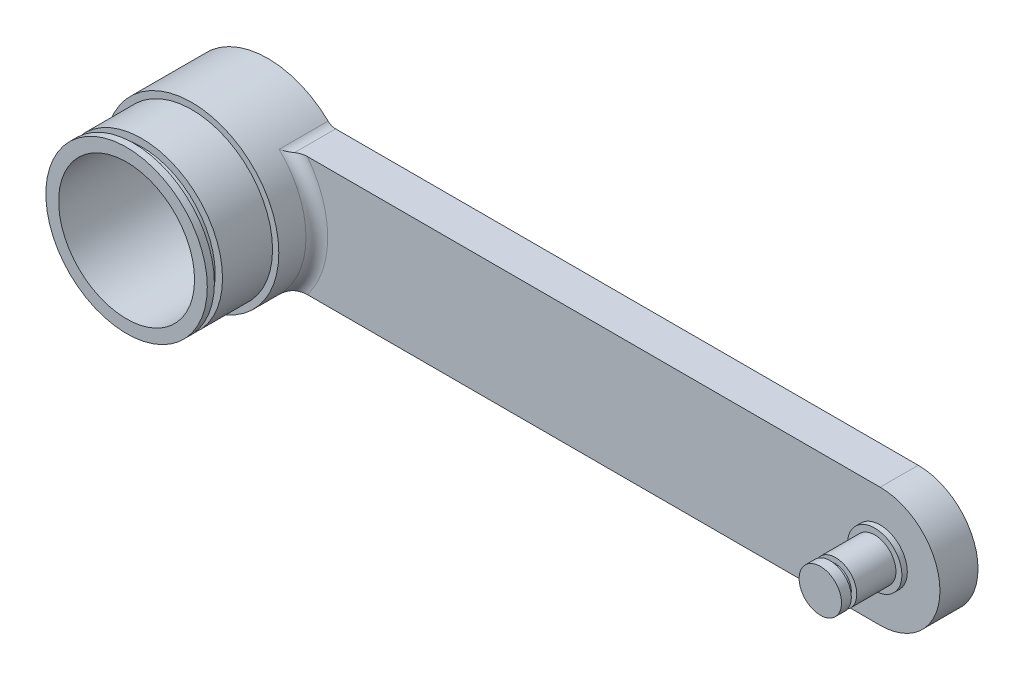
ISO-10303-21;
HEADER;
FILE_DESCRIPTION(('STEP AP214'),'2;1');
FILE_NAME('part.step','',(''),(''),'','','');
FILE_SCHEMA(('AUTOMOTIVE_DESIGN { 1 0 10303 214 1 1 1 1 }'));
ENDSEC;
DATA;
#1=APPLICATION_CONTEXT('core data for automotive mechanical design processes');
#2=APPLICATION_PROTOCOL_DEFINITION('international standard','automotive_design',2000,#1);
#3=PRODUCT_CONTEXT('',#1,'mechanical');
#4=PRODUCT('Part','Part','',(#3));
#5=PRODUCT_RELATED_PRODUCT_CATEGORY('part','',(#4));
#6=PRODUCT_DEFINITION_FORMATION('','',#4);
#7=PRODUCT_DEFINITION_CONTEXT('part definition',#1,'design');
#8=PRODUCT_DEFINITION('design','',#6,#7);
#9=PRODUCT_DEFINITION_SHAPE('','',#8);
#10=(LENGTH_UNIT() NAMED_UNIT(*) SI_UNIT(.MILLI.,.METRE.));
#11=(NAMED_UNIT(*) PLANE_ANGLE_UNIT() SI_UNIT($,.RADIAN.));
#12=(NAMED_UNIT(*) SI_UNIT($,.STERADIAN.) SOLID_ANGLE_UNIT());
#13=UNCERTAINTY_MEASURE_WITH_UNIT(LENGTH_MEASURE(1.E-05),#10,'distance_accuracy_value','');
#14=(GEOMETRIC_REPRESENTATION_CONTEXT(3) GLOBAL_UNCERTAINTY_ASSIGNED_CONTEXT((#13)) GLOBAL_UNIT_ASSIGNED_CONTEXT((#10,
#11,#12)) REPRESENTATION_CONTEXT('',''));
#15=CARTESIAN_POINT('',(0.,0.,0.));
#16=DIRECTION('',(0.,0.,1.));
#17=DIRECTION('',(1.,0.,0.));
#18=AXIS2_PLACEMENT_3D('',#15,#16,#17);
#19=CARTESIAN_POINT('',(119.609580579279,0.,18.));
#20=DIRECTION('',(0.,0.,-1.));
#21=DIRECTION('',(-1.,0.,0.));
#22=AXIS2_PLACEMENT_3D('',#19,#20,#21);
#23=CYLINDRICAL_SURFACE('',#22,3.9);
#24=CARTESIAN_POINT('',(119.609580579279,0.,8.));
#25=DIRECTION('',(0.,0.,1.));
#26=DIRECTION('',(1.,0.,0.));
#27=AXIS2_PLACEMENT_3D('',#24,#25,#26);
#28=CIRCLE('',#27,3.9);
#29=CARTESIAN_POINT('',(123.509580579279,0.,8.));
#30=VERTEX_POINT('',#29);
#31=EDGE_CURVE('E125',#30,#30,#28,.T.);
#32=ORIENTED_EDGE('',*,*,#31,.T.);
#33=EDGE_LOOP('',(#32));
#34=FACE_BOUND('',#33,.T.);
#35=CARTESIAN_POINT('',(119.609580579279,0.,15.2));
#36=DIRECTION('',(0.,0.,1.));
#37=DIRECTION('',(1.,0.,0.));
#38=AXIS2_PLACEMENT_3D('',#35,#36,#37);
#39=CIRCLE('',#38,3.9);
#40=CARTESIAN_POINT('',(123.509580579279,0.,15.2));
#41=VERTEX_POINT('',#40);
#42=EDGE_CURVE('E265',#41,#41,#39,.T.);
#43=ORIENTED_EDGE('',*,*,#42,.F.);
#44=EDGE_LOOP('',(#43));
#45=FACE_BOUND('',#44,.T.);
#46=ADVANCED_FACE('F36',(#34,#45),#23,.T.);
#47=CARTESIAN_POINT('',(0.,0.,26.));
#48=DIRECTION('',(0.,0.,-1.));
#49=DIRECTION('',(-1.,0.,0.));
#50=AXIS2_PLACEMENT_3D('',#47,#48,#49);
#51=CYLINDRICAL_SURFACE('',#50,14.85);
#52=CARTESIAN_POINT('',(0.,0.,14.));
#53=DIRECTION('',(0.,0.,1.));
#54=DIRECTION('',(1.,0.,0.));
#55=AXIS2_PLACEMENT_3D('',#52,#53,#54);
#56=CIRCLE('',#55,14.85);
#57=CARTESIAN_POINT('',(14.85,0.,14.));
#58=VERTEX_POINT('',#57);
#59=EDGE_CURVE('E121',#58,#58,#56,.T.);
#60=ORIENTED_EDGE('',*,*,#59,.T.);
#61=EDGE_LOOP('',(#60));
#62=FACE_BOUND('',#61,.T.);
#63=CARTESIAN_POINT('',(0.,0.,23.2));
#64=DIRECTION('',(0.,0.,1.));
#65=DIRECTION('',(1.,0.,0.));
#66=AXIS2_PLACEMENT_3D('',#63,#64,#65);
#67=CIRCLE('',#66,14.85);
#68=CARTESIAN_POINT('',(14.85,0.,23.2));
#69=VERTEX_POINT('',#68);
#70=EDGE_CURVE('E253',#69,#69,#67,.T.);
#71=ORIENTED_EDGE('',*,*,#70,.F.);
#72=EDGE_LOOP('',(#71));
#73=FACE_BOUND('',#72,.T.);
#74=ADVANCED_FACE('F298',(#62,#73),#51,.T.);
#75=CARTESIAN_POINT('',(0.,0.,0.));
#76=DIRECTION('',(0.,0.,1.));
#77=DIRECTION('',(1.,0.,0.));
#78=AXIS2_PLACEMENT_3D('',#75,#76,#77);
#79=CYLINDRICAL_SURFACE('',#78,6.7);
#80=CARTESIAN_POINT('',(0.,0.,0.));
#81=DIRECTION('',(0.,0.,1.));
#82=DIRECTION('',(1.,0.,0.));
#83=AXIS2_PLACEMENT_3D('',#80,#81,#82);
#84=CIRCLE('',#83,6.7);
#85=CARTESIAN_POINT('',(6.7,0.,0.));
#86=VERTEX_POINT('',#85);
#87=EDGE_CURVE('E210',#86,#86,#84,.T.);
#88=ORIENTED_EDGE('',*,*,#87,.F.);
#89=EDGE_LOOP('',(#88));
#90=FACE_BOUND('',#89,.T.);
#91=CARTESIAN_POINT('',(0.,0.,2.));
#92=DIRECTION('',(0.,0.,1.));
#93=DIRECTION('',(1.,0.,0.));
#94=AXIS2_PLACEMENT_3D('',#91,#92,#93);
#95=CIRCLE('',#94,6.7);
#96=CARTESIAN_POINT('',(6.7,0.,2.));
#97=VERTEX_POINT('',#96);
#98=EDGE_CURVE('E222',#97,#97,#95,.T.);
#99=ORIENTED_EDGE('',*,*,#98,.T.);
#100=EDGE_LOOP('',(#99));
#101=FACE_BOUND('',#100,.T.);
#102=ADVANCED_FACE('F305',(#90,#101),#79,.F.);
#103=CARTESIAN_POINT('',(119.609580579279,0.,7.));
#104=DIRECTION('',(0.,0.,-1.));
#105=DIRECTION('',(-1.,0.,0.));
#106=AXIS2_PLACEMENT_3D('',#103,#104,#105);
#107=CYLINDRICAL_SURFACE('',#106,11.);
#108=CARTESIAN_POINT('',(119.609580579279,0.,0.));
#109=DIRECTION('',(0.,0.,1.));
#110=DIRECTION('',(1.,0.,0.));
#111=AXIS2_PLACEMENT_3D('',#108,#109,#110);
#112=CIRCLE('',#111,11.);
#113=CARTESIAN_POINT('',(119.609580579279,-11.,0.));
#114=VERTEX_POINT('',#113);
#115=CARTESIAN_POINT('',(119.609580579279,11.,0.));
#116=VERTEX_POINT('',#115);
#117=EDGE_CURVE('E120',#114,#116,#112,.T.);
#118=ORIENTED_EDGE('',*,*,#117,.T.);
#119=DIRECTION('',(0.,0.,-1.));
#120=VECTOR('',#119,1.);
#121=CARTESIAN_POINT('',(119.609580579279,11.,7.));
#122=LINE('',#121,#120);
#123=CARTESIAN_POINT('',(119.609580579279,11.,7.));
#124=VERTEX_POINT('',#123);
#125=EDGE_CURVE('E102',#124,#116,#122,.T.);
#126=ORIENTED_EDGE('',*,*,#125,.F.);
#127=CARTESIAN_POINT('',(119.609580579279,0.,7.));
#128=DIRECTION('',(0.,0.,1.));
#129=DIRECTION('',(1.,0.,0.));
#130=AXIS2_PLACEMENT_3D('',#127,#128,#129);
#131=CIRCLE('',#130,11.);
#132=CARTESIAN_POINT('',(119.609580579279,-11.,7.));
#133=VERTEX_POINT('',#132);
#134=EDGE_CURVE('E108',#133,#124,#131,.T.);
#135=ORIENTED_EDGE('',*,*,#134,.F.);
#136=DIRECTION('',(0.,0.,-1.));
#137=VECTOR('',#136,1.);
#138=CARTESIAN_POINT('',(119.609580579279,-11.,7.));
#139=LINE('',#138,#137);
#140=EDGE_CURVE('E122',#133,#114,#139,.T.);
#141=ORIENTED_EDGE('',*,*,#140,.T.);
#142=EDGE_LOOP('',(#118,#126,#135,#141));
#143=FACE_BOUND('',#142,.T.);
#144=ADVANCED_FACE('F118',(#143),#107,.T.);
#145=CARTESIAN_POINT('',(119.609580579279,11.,7.));
#146=DIRECTION('',(0.,-1.,0.));
#147=DIRECTION('',(0.,0.,-1.));
#148=AXIS2_PLACEMENT_3D('',#145,#146,#147);
#149=PLANE('',#148);
#150=DIRECTION('',(-1.,0.,0.));
#151=VECTOR('',#150,1.);
#152=CARTESIAN_POINT('',(119.609580579279,11.,0.));
#153=LINE('',#152,#151);
#154=CARTESIAN_POINT('',(12.4498995979887,11.,0.));
#155=VERTEX_POINT('',#154);
#156=EDGE_CURVE('E206',#116,#155,#153,.T.);
#157=ORIENTED_EDGE('',*,*,#156,.T.);
#158=DIRECTION('',(0.,0.,1.));
#159=VECTOR('',#158,1.);
#160=CARTESIAN_POINT('',(12.4498995979887,11.,7.));
#161=LINE('',#160,#159);
#162=CARTESIAN_POINT('',(12.4498995979887,11.,7.55884833202699));
#163=VERTEX_POINT('',#162);
#164=EDGE_CURVE('E54',#155,#163,#161,.T.);
#165=ORIENTED_EDGE('',*,*,#164,.T.);
#166=CARTESIAN_POINT('',(12.4498995979887,11.,7.55884833202699));
#167=CARTESIAN_POINT('',(12.5198934034948,11.,7.50840170780849));
#168=CARTESIAN_POINT('',(12.592340885976,11.,7.46145728385506));
#169=CARTESIAN_POINT('',(12.7412055261497,11.,7.37451366725892));
#170=CARTESIAN_POINT('',(12.8176188017008,11.,7.33450784297435));
#171=CARTESIAN_POINT('',(12.9717234023388,11.,7.26217367181749));
#172=CARTESIAN_POINT('',(13.0493387757929,11.,7.22968264539804));
#173=CARTESIAN_POINT('',(13.2069412349103,11.,7.17110581897077));
#174=CARTESIAN_POINT('',(13.2869287605535,11.,7.1450212156409));
#175=CARTESIAN_POINT('',(13.509194897095,11.,7.08212802331641));
#176=CARTESIAN_POINT('',(13.6533970955731,11.,7.05185126709123));
#177=CARTESIAN_POINT('',(13.8732117159048,11.,7.0210066230061));
#178=CARTESIAN_POINT('',(13.9478944578916,11.,7.01315092338695));
#179=CARTESIAN_POINT('',(14.0976416219745,11.,7.00265076143241));
#180=CARTESIAN_POINT('',(14.1727061250838,11.,7.00000745579312));
#181=CARTESIAN_POINT('',(14.247806848775,11.,7.));
#182=B_SPLINE_CURVE_WITH_KNOTS('',3,(#166,#167,#168,#169,#170,#171,#172,#173,#174,#175,#176,
#177,#178,#179,#180,#181),.UNSPECIFIED.,.F.,.F.,(4,2,2,2,2,2,2,4),(0.,0.25864631807969,
0.517044053324901,0.769174443388442,1.02135189400267,1.46179163625953,1.68692746322968,
1.91211324506599),.UNSPECIFIED.);
#183=CARTESIAN_POINT('',(14.247806848775,11.,7.));
#184=VERTEX_POINT('',#183);
#185=EDGE_CURVE('E46',#163,#184,#182,.T.);
#186=ORIENTED_EDGE('',*,*,#185,.T.);
#187=DIRECTION('',(-1.,0.,0.));
#188=VECTOR('',#187,1.);
#189=CARTESIAN_POINT('',(119.609580579279,11.,7.));
#190=LINE('',#189,#188);
#191=EDGE_CURVE('E98',#124,#184,#190,.T.);
#192=ORIENTED_EDGE('',*,*,#191,.F.);
#193=ORIENTED_EDGE('',*,*,#125,.T.);
#194=EDGE_LOOP('',(#157,#165,#186,#192,#193));
#195=FACE_BOUND('',#194,.T.);
#196=ADVANCED_FACE('F100',(#195),#149,.F.);
#197=CARTESIAN_POINT('',(0.,0.,7.));
#198=DIRECTION('',(0.,0.,-1.));
#199=DIRECTION('',(-1.,0.,0.));
#200=AXIS2_PLACEMENT_3D('',#197,#198,#199);
#201=CYLINDRICAL_SURFACE('',#200,16.);
#202=CARTESIAN_POINT('',(0.,0.,0.));
#203=DIRECTION('',(0.,0.,1.));
#204=DIRECTION('',(1.,0.,0.));
#205=AXIS2_PLACEMENT_3D('',#202,#203,#204);
#206=CIRCLE('',#205,16.);
#207=CARTESIAN_POINT('',(11.0665774204344,11.5555555555556,0.));
#208=VERTEX_POINT('',#207);
#209=CARTESIAN_POINT('',(11.0665774204344,-11.5555555555556,0.));
#210=VERTEX_POINT('',#209);
#211=EDGE_CURVE('E207',#208,#210,#206,.T.);
#212=ORIENTED_EDGE('',*,*,#211,.T.);
#213=DIRECTION('',(0.,0.,-1.));
#214=VECTOR('',#213,1.);
#215=CARTESIAN_POINT('',(11.0665774204344,-11.5555555555556,7.));
#216=LINE('',#215,#214);
#217=CARTESIAN_POINT('',(11.0665774204344,-11.5555555555556,9.));
#218=VERTEX_POINT('',#217);
#219=EDGE_CURVE('E135',#210,#218,#216,.F.);
#220=ORIENTED_EDGE('',*,*,#219,.T.);
#221=CARTESIAN_POINT('',(0.,0.,9.));
#222=DIRECTION('',(0.,0.,1.));
#223=DIRECTION('',(1.,0.,0.));
#224=AXIS2_PLACEMENT_3D('',#221,#222,#223);
#225=CIRCLE('',#224,16.);
#226=CARTESIAN_POINT('',(11.0665774204344,11.5555555555556,9.));
#227=VERTEX_POINT('',#226);
#228=EDGE_CURVE('E131',#218,#227,#225,.T.);
#229=ORIENTED_EDGE('',*,*,#228,.T.);
#230=DIRECTION('',(0.,0.,-1.));
#231=VECTOR('',#230,1.);
#232=CARTESIAN_POINT('',(11.0665774204344,11.5555555555556,7.));
#233=LINE('',#232,#231);
#234=EDGE_CURVE('E133',#227,#208,#233,.T.);
#235=ORIENTED_EDGE('',*,*,#234,.T.);
#236=EDGE_LOOP('',(#212,#220,#229,#235));
#237=FACE_BOUND('',#236,.T.);
#238=CARTESIAN_POINT('',(0.,0.,14.));
#239=DIRECTION('',(0.,0.,1.));
#240=DIRECTION('',(1.,0.,0.));
#241=AXIS2_PLACEMENT_3D('',#238,#239,#240);
#242=CIRCLE('',#241,16.);
#243=CARTESIAN_POINT('',(16.,0.,14.));
#244=VERTEX_POINT('',#243);
#245=EDGE_CURVE('E225',#244,#244,#242,.T.);
#246=ORIENTED_EDGE('',*,*,#245,.F.);
#247=EDGE_LOOP('',(#246));
#248=FACE_BOUND('',#247,.T.);
#249=ADVANCED_FACE('F199',(#237,#248),#201,.T.);
#250=CARTESIAN_POINT('',(119.609580579279,-11.,7.));
#251=DIRECTION('',(0.,1.,0.));
#252=DIRECTION('',(0.,0.,1.));
#253=AXIS2_PLACEMENT_3D('',#250,#251,#252);
#254=PLANE('',#253);
#255=DIRECTION('',(1.,0.,0.));
#256=VECTOR('',#255,1.);
#257=CARTESIAN_POINT('',(119.609580579279,-11.,7.));
#258=LINE('',#257,#256);
#259=CARTESIAN_POINT('',(14.247806848775,-11.,7.));
#260=VERTEX_POINT('',#259);
#261=EDGE_CURVE('E107',#260,#133,#258,.T.);
#262=ORIENTED_EDGE('',*,*,#261,.F.);
#263=CARTESIAN_POINT('',(14.247806848775,-11.,7.));
#264=CARTESIAN_POINT('',(14.1620066686675,-11.,7.00000996295112));
#265=CARTESIAN_POINT('',(14.0762488115896,-11.,7.00345925649057));
#266=CARTESIAN_POINT('',(13.9052719466268,-11.,7.0171517939016));
#267=CARTESIAN_POINT('',(13.8200529677769,-11.,7.02739540075588));
#268=CARTESIAN_POINT('',(13.5701806435761,-11.,7.06750287878596));
#269=CARTESIAN_POINT('',(13.4069307537515,-11.,7.10676105889485));
#270=CARTESIAN_POINT('',(13.1073346332357,-11.,7.20448646805292));
#271=CARTESIAN_POINT('',(12.970077837166,-11.,7.26016272971696));
#272=CARTESIAN_POINT('',(12.7702024622157,-11.,7.3593527204001));
#273=CARTESIAN_POINT('',(12.7038902895375,-11.,7.39551226684036));
#274=CARTESIAN_POINT('',(12.57439081699,-11.,7.47316151120221));
#275=CARTESIAN_POINT('',(12.5112063027516,-11.,7.51465584629199));
#276=CARTESIAN_POINT('',(12.4498995979887,-11.,7.55884833202699));
#277=B_SPLINE_CURVE_WITH_KNOTS('',3,(#263,#264,#265,#266,#267,#268,#269,#270,#271,#272,#273,
#274,#275,#276),.UNSPECIFIED.,.F.,.F.,(4,2,2,2,2,2,4),(0.,0.257250682436265,0.51451510946463,
1.01604335114206,1.45878502012235,1.68514857470848,1.91171023910764),.UNSPECIFIED.);
#278=CARTESIAN_POINT('',(12.4498995979887,-11.,7.55884833202699));
#279=VERTEX_POINT('',#278);
#280=EDGE_CURVE('E11',#260,#279,#277,.T.);
#281=ORIENTED_EDGE('',*,*,#280,.T.);
#282=DIRECTION('',(0.,0.,1.));
#283=VECTOR('',#282,1.);
#284=CARTESIAN_POINT('',(12.4498995979887,-11.,0.));
#285=LINE('',#284,#283);
#286=CARTESIAN_POINT('',(12.4498995979887,-11.,0.));
#287=VERTEX_POINT('',#286);
#288=EDGE_CURVE('E62',#279,#287,#285,.F.);
#289=ORIENTED_EDGE('',*,*,#288,.T.);
#290=DIRECTION('',(1.,0.,0.));
#291=VECTOR('',#290,1.);
#292=CARTESIAN_POINT('',(119.609580579279,-11.,0.));
#293=LINE('',#292,#291);
#294=EDGE_CURVE('E116',#287,#114,#293,.T.);
#295=ORIENTED_EDGE('',*,*,#294,.T.);
#296=ORIENTED_EDGE('',*,*,#140,.F.);
#297=EDGE_LOOP('',(#262,#281,#289,#295,#296));
#298=FACE_BOUND('',#297,.T.);
#299=ADVANCED_FACE('F215',(#298),#254,.F.);
#300=CARTESIAN_POINT('',(119.609580579279,0.,7.));
#301=DIRECTION('',(0.,0.,1.));
#302=DIRECTION('',(1.,0.,0.));
#303=AXIS2_PLACEMENT_3D('',#300,#301,#302);
#304=PLANE('',#303);
#305=CARTESIAN_POINT('',(119.609580579279,0.,7.));
#306=DIRECTION('',(0.,0.,1.));
#307=DIRECTION('',(1.,0.,0.));
#308=AXIS2_PLACEMENT_3D('',#305,#306,#307);
#309=CIRCLE('',#308,5.);
#310=CARTESIAN_POINT('',(124.609580579279,0.,7.));
#311=VERTEX_POINT('',#310);
#312=EDGE_CURVE('E235',#311,#311,#309,.T.);
#313=ORIENTED_EDGE('',*,*,#312,.F.);
#314=EDGE_LOOP('',(#313));
#315=FACE_BOUND('',#314,.T.);
#316=ORIENTED_EDGE('',*,*,#191,.T.);
#317=CARTESIAN_POINT('',(0.,0.,7.));
#318=DIRECTION('',(0.,0.,1.));
#319=DIRECTION('',(1.,0.,0.));
#320=AXIS2_PLACEMENT_3D('',#317,#318,#319);
#321=CIRCLE('',#320,18.);
#322=EDGE_CURVE('E138',#184,#260,#321,.F.);
#323=ORIENTED_EDGE('',*,*,#322,.T.);
#324=ORIENTED_EDGE('',*,*,#261,.T.);
#325=ORIENTED_EDGE('',*,*,#134,.T.);
#326=EDGE_LOOP('',(#316,#323,#324,#325));
#327=FACE_BOUND('',#326,.T.);
#328=ADVANCED_FACE('F111',(#315,#327),#304,.T.);
#329=CARTESIAN_POINT('',(119.609580579279,0.,0.));
#330=DIRECTION('',(0.,0.,1.));
#331=DIRECTION('',(1.,0.,0.));
#332=AXIS2_PLACEMENT_3D('',#329,#330,#331);
#333=PLANE('',#332);
#334=CARTESIAN_POINT('',(0.,-9.5,0.));
#335=DIRECTION('',(0.,0.,-1.));
#336=DIRECTION('',(-1.,0.,0.));
#337=AXIS2_PLACEMENT_3D('',#334,#335,#336);
#338=CIRCLE('',#337,1.5);
#339=CARTESIAN_POINT('',(-1.5,-9.5,0.));
#340=VERTEX_POINT('',#339);
#341=EDGE_CURVE('E185',#340,#340,#338,.T.);
#342=ORIENTED_EDGE('',*,*,#341,.F.);
#343=EDGE_LOOP('',(#342));
#344=FACE_BOUND('',#343,.T.);
#345=CARTESIAN_POINT('',(8.22724133595215,4.75000000000004,0.));
#346=DIRECTION('',(0.,0.,-1.));
#347=DIRECTION('',(-1.,0.,0.));
#348=AXIS2_PLACEMENT_3D('',#345,#346,#347);
#349=CIRCLE('',#348,1.5);
#350=CARTESIAN_POINT('',(6.72724133595215,4.75000000000004,0.));
#351=VERTEX_POINT('',#350);
#352=EDGE_CURVE('E247',#351,#351,#349,.T.);
#353=ORIENTED_EDGE('',*,*,#352,.F.);
#354=EDGE_LOOP('',(#353));
#355=FACE_BOUND('',#354,.T.);
#356=CARTESIAN_POINT('',(-8.22724133595221,4.74999999999992,0.));
#357=DIRECTION('',(0.,0.,-1.));
#358=DIRECTION('',(-1.,0.,0.));
#359=AXIS2_PLACEMENT_3D('',#356,#357,#358);
#360=CIRCLE('',#359,1.5);
#361=CARTESIAN_POINT('',(-9.72724133595221,4.74999999999992,0.));
#362=VERTEX_POINT('',#361);
#363=EDGE_CURVE('E244',#362,#362,#360,.T.);
#364=ORIENTED_EDGE('',*,*,#363,.F.);
#365=EDGE_LOOP('',(#364));
#366=FACE_BOUND('',#365,.T.);
#367=ORIENTED_EDGE('',*,*,#87,.T.);
#368=EDGE_LOOP('',(#367));
#369=FACE_BOUND('',#368,.T.);
#370=ORIENTED_EDGE('',*,*,#117,.F.);
#371=ORIENTED_EDGE('',*,*,#294,.F.);
#372=CARTESIAN_POINT('',(12.4498995979887,-13.,0.));
#373=DIRECTION('',(0.,0.,1.));
#374=DIRECTION('',(1.,0.,0.));
#375=AXIS2_PLACEMENT_3D('',#372,#373,#374);
#376=CIRCLE('',#375,2.);
#377=EDGE_CURVE('E140',#287,#210,#376,.T.);
#378=ORIENTED_EDGE('',*,*,#377,.T.);
#379=ORIENTED_EDGE('',*,*,#211,.F.);
#380=CARTESIAN_POINT('',(12.4498995979887,13.,0.));
#381=DIRECTION('',(0.,0.,1.));
#382=DIRECTION('',(1.,0.,0.));
#383=AXIS2_PLACEMENT_3D('',#380,#381,#382);
#384=CIRCLE('',#383,2.);
#385=EDGE_CURVE('E142',#208,#155,#384,.T.);
#386=ORIENTED_EDGE('',*,*,#385,.T.);
#387=ORIENTED_EDGE('',*,*,#156,.F.);
#388=EDGE_LOOP('',(#370,#371,#378,#379,#386,#387));
#389=FACE_BOUND('',#388,.T.);
#390=ADVANCED_FACE('F205',(#344,#355,#366,#369,#389),#333,.F.);
#391=CARTESIAN_POINT('',(0.,0.,2.));
#392=DIRECTION('',(0.,0.,1.));
#393=DIRECTION('',(1.,0.,0.));
#394=AXIS2_PLACEMENT_3D('',#391,#392,#393);
#395=CYLINDRICAL_SURFACE('',#394,12.5);
#396=CARTESIAN_POINT('',(0.,0.,2.));
#397=DIRECTION('',(0.,0.,1.));
#398=DIRECTION('',(1.,0.,0.));
#399=AXIS2_PLACEMENT_3D('',#396,#397,#398);
#400=CIRCLE('',#399,12.5);
#401=CARTESIAN_POINT('',(12.5,0.,2.));
#402=VERTEX_POINT('',#401);
#403=EDGE_CURVE('E219',#402,#402,#400,.T.);
#404=ORIENTED_EDGE('',*,*,#403,.F.);
#405=EDGE_LOOP('',(#404));
#406=FACE_BOUND('',#405,.T.);
#407=CARTESIAN_POINT('',(0.,0.,26.));
#408=DIRECTION('',(0.,0.,1.));
#409=DIRECTION('',(1.,0.,0.));
#410=AXIS2_PLACEMENT_3D('',#407,#408,#409);
#411=CIRCLE('',#410,12.5);
#412=CARTESIAN_POINT('',(12.5,0.,26.));
#413=VERTEX_POINT('',#412);
#414=EDGE_CURVE('E231',#413,#413,#411,.T.);
#415=ORIENTED_EDGE('',*,*,#414,.T.);
#416=EDGE_LOOP('',(#415));
#417=FACE_BOUND('',#416,.T.);
#418=ADVANCED_FACE('F483',(#406,#417),#395,.F.);
#419=CARTESIAN_POINT('',(0.,0.,2.));
#420=DIRECTION('',(0.,0.,1.));
#421=DIRECTION('',(1.,0.,0.));
#422=AXIS2_PLACEMENT_3D('',#419,#420,#421);
#423=PLANE('',#422);
#424=CARTESIAN_POINT('',(0.,-9.5,2.));
#425=DIRECTION('',(0.,0.,1.));
#426=DIRECTION('',(1.,0.,0.));
#427=AXIS2_PLACEMENT_3D('',#424,#425,#426);
#428=CIRCLE('',#427,1.5);
#429=CARTESIAN_POINT('',(1.5,-9.5,2.));
#430=VERTEX_POINT('',#429);
#431=EDGE_CURVE('E41',#430,#430,#428,.T.);
#432=ORIENTED_EDGE('',*,*,#431,.F.);
#433=EDGE_LOOP('',(#432));
#434=FACE_BOUND('',#433,.T.);
#435=CARTESIAN_POINT('',(8.22724133595215,4.75000000000004,2.));
#436=DIRECTION('',(0.,0.,1.));
#437=DIRECTION('',(1.,0.,0.));
#438=AXIS2_PLACEMENT_3D('',#435,#436,#437);
#439=CIRCLE('',#438,1.5);
#440=CARTESIAN_POINT('',(9.72724133595215,4.75000000000004,2.));
#441=VERTEX_POINT('',#440);
#442=EDGE_CURVE('E184',#441,#441,#439,.T.);
#443=ORIENTED_EDGE('',*,*,#442,.F.);
#444=EDGE_LOOP('',(#443));
#445=FACE_BOUND('',#444,.T.);
#446=CARTESIAN_POINT('',(-8.22724133595221,4.74999999999992,2.));
#447=DIRECTION('',(0.,0.,1.));
#448=DIRECTION('',(1.,0.,0.));
#449=AXIS2_PLACEMENT_3D('',#446,#447,#448);
#450=CIRCLE('',#449,1.5);
#451=CARTESIAN_POINT('',(-6.72724133595221,4.74999999999992,2.));
#452=VERTEX_POINT('',#451);
#453=EDGE_CURVE('E182',#452,#452,#450,.T.);
#454=ORIENTED_EDGE('',*,*,#453,.F.);
#455=EDGE_LOOP('',(#454));
#456=FACE_BOUND('',#455,.T.);
#457=ORIENTED_EDGE('',*,*,#98,.F.);
#458=EDGE_LOOP('',(#457));
#459=FACE_BOUND('',#458,.T.);
#460=ORIENTED_EDGE('',*,*,#403,.T.);
#461=EDGE_LOOP('',(#460));
#462=FACE_BOUND('',#461,.T.);
#463=ADVANCED_FACE('F479',(#434,#445,#456,#459,#462),#423,.T.);
#464=CARTESIAN_POINT('',(0.,0.,14.));
#465=DIRECTION('',(0.,0.,1.));
#466=DIRECTION('',(1.,0.,0.));
#467=AXIS2_PLACEMENT_3D('',#464,#465,#466);
#468=PLANE('',#467);
#469=ORIENTED_EDGE('',*,*,#59,.F.);
#470=EDGE_LOOP('',(#469));
#471=FACE_BOUND('',#470,.T.);
#472=ORIENTED_EDGE('',*,*,#245,.T.);
#473=EDGE_LOOP('',(#472));
#474=FACE_BOUND('',#473,.T.);
#475=ADVANCED_FACE('F475',(#471,#474),#468,.T.);
#476=CARTESIAN_POINT('',(0.,0.,26.));
#477=DIRECTION('',(0.,0.,1.));
#478=DIRECTION('',(1.,0.,0.));
#479=AXIS2_PLACEMENT_3D('',#476,#477,#478);
#480=PLANE('',#479);
#481=CARTESIAN_POINT('',(0.,0.,26.));
#482=DIRECTION('',(0.,0.,1.));
#483=DIRECTION('',(1.,0.,0.));
#484=AXIS2_PLACEMENT_3D('',#481,#482,#483);
#485=CIRCLE('',#484,14.85);
#486=CARTESIAN_POINT('',(14.85,0.,26.));
#487=VERTEX_POINT('',#486);
#488=EDGE_CURVE('E227',#487,#487,#485,.T.);
#489=ORIENTED_EDGE('',*,*,#488,.T.);
#490=EDGE_LOOP('',(#489));
#491=FACE_BOUND('',#490,.T.);
#492=ORIENTED_EDGE('',*,*,#414,.F.);
#493=EDGE_LOOP('',(#492));
#494=FACE_BOUND('',#493,.T.);
#495=ADVANCED_FACE('F446',(#491,#494),#480,.T.);
#496=CARTESIAN_POINT('',(0.,0.,24.7));
#497=DIRECTION('',(0.,0.,1.));
#498=DIRECTION('',(1.,0.,0.));
#499=AXIS2_PLACEMENT_3D('',#496,#497,#498);
#500=CIRCLE('',#499,14.85);
#501=CARTESIAN_POINT('',(14.85,0.,24.7));
#502=VERTEX_POINT('',#501);
#503=EDGE_CURVE('E248',#502,#502,#500,.T.);
#504=ORIENTED_EDGE('',*,*,#503,.T.);
#505=EDGE_LOOP('',(#504));
#506=FACE_BOUND('',#505,.T.);
#507=ORIENTED_EDGE('',*,*,#488,.F.);
#508=EDGE_LOOP('',(#507));
#509=FACE_BOUND('',#508,.T.);
#510=ADVANCED_FACE('F308',(#506,#509),#51,.T.);
#511=CARTESIAN_POINT('',(119.609580579279,0.,8.));
#512=DIRECTION('',(0.,0.,-1.));
#513=DIRECTION('',(-1.,0.,0.));
#514=AXIS2_PLACEMENT_3D('',#511,#512,#513);
#515=CYLINDRICAL_SURFACE('',#514,5.);
#516=CARTESIAN_POINT('',(119.609580579279,0.,8.));
#517=DIRECTION('',(0.,0.,1.));
#518=DIRECTION('',(1.,0.,0.));
#519=AXIS2_PLACEMENT_3D('',#516,#517,#518);
#520=CIRCLE('',#519,5.);
#521=CARTESIAN_POINT('',(124.609580579279,0.,8.));
#522=VERTEX_POINT('',#521);
#523=EDGE_CURVE('E234',#522,#522,#520,.T.);
#524=ORIENTED_EDGE('',*,*,#523,.F.);
#525=EDGE_LOOP('',(#524));
#526=FACE_BOUND('',#525,.T.);
#527=ORIENTED_EDGE('',*,*,#312,.T.);
#528=EDGE_LOOP('',(#527));
#529=FACE_BOUND('',#528,.T.);
#530=ADVANCED_FACE('F445',(#526,#529),#515,.T.);
#531=CARTESIAN_POINT('',(119.609580579279,0.,8.));
#532=DIRECTION('',(0.,0.,1.));
#533=DIRECTION('',(1.,0.,0.));
#534=AXIS2_PLACEMENT_3D('',#531,#532,#533);
#535=PLANE('',#534);
#536=ORIENTED_EDGE('',*,*,#31,.F.);
#537=EDGE_LOOP('',(#536));
#538=FACE_BOUND('',#537,.T.);
#539=ORIENTED_EDGE('',*,*,#523,.T.);
#540=EDGE_LOOP('',(#539));
#541=FACE_BOUND('',#540,.T.);
#542=ADVANCED_FACE('F378',(#538,#541),#535,.T.);
#543=CARTESIAN_POINT('',(12.4498995979887,13.,7.));
#544=DIRECTION('',(0.,0.,-1.));
#545=DIRECTION('',(-1.,0.,0.));
#546=AXIS2_PLACEMENT_3D('',#543,#544,#545);
#547=CYLINDRICAL_SURFACE('',#546,2.);
#548=ORIENTED_EDGE('',*,*,#385,.F.);
#549=ORIENTED_EDGE('',*,*,#234,.F.);
#550=CARTESIAN_POINT('',(12.4498995979887,11.,7.55884833202699));
#551=CARTESIAN_POINT('',(12.3807297521811,11.0000230210499,7.60874129148272));
#552=CARTESIAN_POINT('',(12.3129984328422,11.0035868864895,7.66048552810663));
#553=CARTESIAN_POINT('',(12.1806841466547,11.0170828632821,7.76688130926957));
#554=CARTESIAN_POINT('',(12.1160962966404,11.0270047345429,7.82152804952661));
#555=CARTESIAN_POINT('',(11.9903205988646,11.052466653318,7.93291810765091));
#556=CARTESIAN_POINT('',(11.9291224337636,11.0679884331368,7.9896540759158));
#557=CARTESIAN_POINT('',(11.8099442642111,11.104127024789,8.1048834951156));
#558=CARTESIAN_POINT('',(11.7519657375912,11.1247461530436,8.16337773442775));
#559=CARTESIAN_POINT('',(11.5767146870277,11.1960996004724,8.347337119277));
#560=CARTESIAN_POINT('',(11.4650359268137,11.2548626466711,8.47509208439124));
#561=CARTESIAN_POINT('',(11.2566281633905,11.3901816914422,8.73310098545154));
#562=CARTESIAN_POINT('',(11.1598891375579,11.4667256742272,8.86335317955699));
#563=CARTESIAN_POINT('',(11.0695338101219,11.5527286256784,8.99566142512902));
#564=CARTESIAN_POINT('',(11.0680545215259,11.5541409743412,8.99783073155668));
#565=CARTESIAN_POINT('',(11.0665774204344,11.5555555555556,9.));
#566=B_SPLINE_CURVE_WITH_KNOTS('',3,(#550,#551,#552,#553,#554,#555,#556,#557,#558,#559,#560,
#561,#562,#563,#564,#565),.UNSPECIFIED.,.F.,.F.,(4,2,2,2,2,2,2,4),(0.,0.255633233377243,
0.510855779646763,0.76525317231605,1.01976638565182,1.55669669159007,2.09326520735819,
2.10220948422006),.UNSPECIFIED.);
#567=EDGE_CURVE('E174',#163,#227,#566,.T.);
#568=ORIENTED_EDGE('',*,*,#567,.F.);
#569=ORIENTED_EDGE('',*,*,#164,.F.);
#570=EDGE_LOOP('',(#548,#549,#568,#569));
#571=FACE_BOUND('',#570,.T.);
#572=ADVANCED_FACE('F38',(#571),#547,.F.);
#573=CARTESIAN_POINT('',(0.,0.,9.));
#574=DIRECTION('',(0.,0.,1.));
#575=DIRECTION('',(1.,0.,0.));
#576=AXIS2_PLACEMENT_3D('',#573,#574,#575);
#577=TOROIDAL_SURFACE('',#576,18.,2.);
#578=ORIENTED_EDGE('',*,*,#567,.T.);
#579=ORIENTED_EDGE('',*,*,#228,.F.);
#580=CARTESIAN_POINT('',(12.4498995979887,-11.,7.55884833202699));
#581=CARTESIAN_POINT('',(12.3807297521811,-11.0000230210499,7.60874129148272));
#582=CARTESIAN_POINT('',(12.3129984328422,-11.0035868864895,7.66048552810663));
#583=CARTESIAN_POINT('',(12.1806841466547,-11.0170828632821,7.76688130926957));
#584=CARTESIAN_POINT('',(12.1160962966404,-11.0270047345429,7.82152804952661));
#585=CARTESIAN_POINT('',(11.9903205988646,-11.052466653318,7.93291810765091));
#586=CARTESIAN_POINT('',(11.9291224337636,-11.0679884331368,7.9896540759158));
#587=CARTESIAN_POINT('',(11.8099442642111,-11.104127024789,8.1048834951156));
#588=CARTESIAN_POINT('',(11.7519657375912,-11.1247461530436,8.16337773442775));
#589=CARTESIAN_POINT('',(11.5767146870277,-11.1960996004724,8.347337119277));
#590=CARTESIAN_POINT('',(11.4650359268137,-11.2548626466711,8.47509208439124));
#591=CARTESIAN_POINT('',(11.2566281633905,-11.3901816914422,8.73310098545154));
#592=CARTESIAN_POINT('',(11.1598891375579,-11.4667256742272,8.86335317955699));
#593=CARTESIAN_POINT('',(11.0695338101219,-11.5527286256784,8.99566142512902));
#594=CARTESIAN_POINT('',(11.0680545215259,-11.5541409743412,8.99783073155668));
#595=CARTESIAN_POINT('',(11.0665774204344,-11.5555555555556,9.));
#596=B_SPLINE_CURVE_WITH_KNOTS('',3,(#580,#581,#582,#583,#584,#585,#586,#587,#588,#589,#590,
#591,#592,#593,#594,#595),.UNSPECIFIED.,.F.,.F.,(4,2,2,2,2,2,2,4),(0.,0.255633233377243,
0.510855779646763,0.76525317231605,1.01976638565182,1.55669669159007,2.09326520735819,
2.10220948422006),.UNSPECIFIED.);
#597=EDGE_CURVE('E167',#279,#218,#596,.T.);
#598=ORIENTED_EDGE('',*,*,#597,.F.);
#599=ORIENTED_EDGE('',*,*,#280,.F.);
#600=ORIENTED_EDGE('',*,*,#322,.F.);
#601=ORIENTED_EDGE('',*,*,#185,.F.);
#602=EDGE_LOOP('',(#578,#579,#598,#599,#600,#601));
#603=FACE_BOUND('',#602,.T.);
#604=ADVANCED_FACE('F158',(#603),#577,.F.);
#605=CARTESIAN_POINT('',(12.4498995979887,-13.,7.));
#606=DIRECTION('',(0.,0.,-1.));
#607=DIRECTION('',(-1.,0.,0.));
#608=AXIS2_PLACEMENT_3D('',#605,#606,#607);
#609=CYLINDRICAL_SURFACE('',#608,2.);
#610=ORIENTED_EDGE('',*,*,#597,.T.);
#611=ORIENTED_EDGE('',*,*,#219,.F.);
#612=ORIENTED_EDGE('',*,*,#377,.F.);
#613=ORIENTED_EDGE('',*,*,#288,.F.);
#614=EDGE_LOOP('',(#610,#611,#612,#613));
#615=FACE_BOUND('',#614,.T.);
#616=ADVANCED_FACE('F162',(#615),#609,.F.);
#617=CARTESIAN_POINT('',(-8.22724133595221,4.74999999999992,10.));
#618=DIRECTION('',(0.,0.,-1.));
#619=DIRECTION('',(-1.,0.,0.));
#620=AXIS2_PLACEMENT_3D('',#617,#618,#619);
#621=CYLINDRICAL_SURFACE('',#620,1.5);
#622=ORIENTED_EDGE('',*,*,#453,.T.);
#623=EDGE_LOOP('',(#622));
#624=FACE_BOUND('',#623,.T.);
#625=ORIENTED_EDGE('',*,*,#363,.T.);
#626=EDGE_LOOP('',(#625));
#627=FACE_BOUND('',#626,.T.);
#628=ADVANCED_FACE('F324',(#624,#627),#621,.F.);
#629=CARTESIAN_POINT('',(8.22724133595215,4.75000000000004,10.));
#630=DIRECTION('',(0.,0.,-1.));
#631=DIRECTION('',(-1.,0.,0.));
#632=AXIS2_PLACEMENT_3D('',#629,#630,#631);
#633=CYLINDRICAL_SURFACE('',#632,1.5);
#634=ORIENTED_EDGE('',*,*,#442,.T.);
#635=EDGE_LOOP('',(#634));
#636=FACE_BOUND('',#635,.T.);
#637=ORIENTED_EDGE('',*,*,#352,.T.);
#638=EDGE_LOOP('',(#637));
#639=FACE_BOUND('',#638,.T.);
#640=ADVANCED_FACE('F327',(#636,#639),#633,.F.);
#641=CARTESIAN_POINT('',(0.,-9.5,10.));
#642=DIRECTION('',(0.,0.,-1.));
#643=DIRECTION('',(-1.,0.,0.));
#644=AXIS2_PLACEMENT_3D('',#641,#642,#643);
#645=CYLINDRICAL_SURFACE('',#644,1.5);
#646=ORIENTED_EDGE('',*,*,#431,.T.);
#647=EDGE_LOOP('',(#646));
#648=FACE_BOUND('',#647,.T.);
#649=ORIENTED_EDGE('',*,*,#341,.T.);
#650=EDGE_LOOP('',(#649));
#651=FACE_BOUND('',#650,.T.);
#652=ADVANCED_FACE('F331',(#648,#651),#645,.F.);
#653=CARTESIAN_POINT('',(0.,0.,24.7));
#654=DIRECTION('',(0.,0.,1.));
#655=DIRECTION('',(1.,0.,0.));
#656=AXIS2_PLACEMENT_3D('',#653,#654,#655);
#657=PLANE('',#656);
#658=ORIENTED_EDGE('',*,*,#503,.F.);
#659=EDGE_LOOP('',(#658));
#660=FACE_BOUND('',#659,.T.);
#661=CARTESIAN_POINT('',(0.,0.,24.7));
#662=DIRECTION('',(0.,0.,1.));
#663=DIRECTION('',(1.,0.,0.));
#664=AXIS2_PLACEMENT_3D('',#661,#662,#663);
#665=CIRCLE('',#664,13.5);
#666=CARTESIAN_POINT('',(13.5,0.,24.7));
#667=VERTEX_POINT('',#666);
#668=EDGE_CURVE('E256',#667,#667,#665,.T.);
#669=ORIENTED_EDGE('',*,*,#668,.T.);
#670=EDGE_LOOP('',(#669));
#671=FACE_BOUND('',#670,.T.);
#672=ADVANCED_FACE('F334',(#660,#671),#657,.F.);
#673=CARTESIAN_POINT('',(0.,0.,23.2));
#674=DIRECTION('',(0.,0.,1.));
#675=DIRECTION('',(1.,0.,0.));
#676=AXIS2_PLACEMENT_3D('',#673,#674,#675);
#677=PLANE('',#676);
#678=ORIENTED_EDGE('',*,*,#70,.T.);
#679=EDGE_LOOP('',(#678));
#680=FACE_BOUND('',#679,.T.);
#681=CARTESIAN_POINT('',(0.,0.,23.2));
#682=DIRECTION('',(0.,0.,1.));
#683=DIRECTION('',(1.,0.,0.));
#684=AXIS2_PLACEMENT_3D('',#681,#682,#683);
#685=CIRCLE('',#684,13.5);
#686=CARTESIAN_POINT('',(13.5,0.,23.2));
#687=VERTEX_POINT('',#686);
#688=EDGE_CURVE('E259',#687,#687,#685,.T.);
#689=ORIENTED_EDGE('',*,*,#688,.F.);
#690=EDGE_LOOP('',(#689));
#691=FACE_BOUND('',#690,.T.);
#692=ADVANCED_FACE('F335',(#680,#691),#677,.T.);
#693=CARTESIAN_POINT('',(0.,0.,24.7));
#694=DIRECTION('',(0.,0.,-1.));
#695=DIRECTION('',(-1.,0.,0.));
#696=AXIS2_PLACEMENT_3D('',#693,#694,#695);
#697=CYLINDRICAL_SURFACE('',#696,13.5);
#698=ORIENTED_EDGE('',*,*,#668,.F.);
#699=EDGE_LOOP('',(#698));
#700=FACE_BOUND('',#699,.T.);
#701=ORIENTED_EDGE('',*,*,#688,.T.);
#702=EDGE_LOOP('',(#701));
#703=FACE_BOUND('',#702,.T.);
#704=ADVANCED_FACE('F293',(#700,#703),#697,.T.);
#705=CARTESIAN_POINT('',(119.609580579279,0.,16.2));
#706=DIRECTION('',(0.,0.,1.));
#707=DIRECTION('',(1.,0.,0.));
#708=AXIS2_PLACEMENT_3D('',#705,#706,#707);
#709=PLANE('',#708);
#710=CARTESIAN_POINT('',(119.609580579279,0.,16.2));
#711=DIRECTION('',(0.,0.,1.));
#712=DIRECTION('',(1.,0.,0.));
#713=AXIS2_PLACEMENT_3D('',#710,#711,#712);
#714=CIRCLE('',#713,3.9);
#715=CARTESIAN_POINT('',(123.509580579279,0.,16.2));
#716=VERTEX_POINT('',#715);
#717=EDGE_CURVE('E262',#716,#716,#714,.T.);
#718=ORIENTED_EDGE('',*,*,#717,.F.);
#719=EDGE_LOOP('',(#718));
#720=FACE_BOUND('',#719,.T.);
#721=CARTESIAN_POINT('',(119.609580579279,0.,16.2));
#722=DIRECTION('',(0.,0.,1.));
#723=DIRECTION('',(1.,0.,0.));
#724=AXIS2_PLACEMENT_3D('',#721,#722,#723);
#725=CIRCLE('',#724,2.9);
#726=CARTESIAN_POINT('',(122.509580579279,0.,16.2));
#727=VERTEX_POINT('',#726);
#728=EDGE_CURVE('E268',#727,#727,#725,.T.);
#729=ORIENTED_EDGE('',*,*,#728,.T.);
#730=EDGE_LOOP('',(#729));
#731=FACE_BOUND('',#730,.T.);
#732=ADVANCED_FACE('F277',(#720,#731),#709,.F.);
#733=CARTESIAN_POINT('',(119.609580579279,0.,15.2));
#734=DIRECTION('',(0.,0.,1.));
#735=DIRECTION('',(1.,0.,0.));
#736=AXIS2_PLACEMENT_3D('',#733,#734,#735);
#737=PLANE('',#736);
#738=ORIENTED_EDGE('',*,*,#42,.T.);
#739=EDGE_LOOP('',(#738));
#740=FACE_BOUND('',#739,.T.);
#741=CARTESIAN_POINT('',(119.609580579279,0.,15.2));
#742=DIRECTION('',(0.,0.,1.));
#743=DIRECTION('',(1.,0.,0.));
#744=AXIS2_PLACEMENT_3D('',#741,#742,#743);
#745=CIRCLE('',#744,2.9);
#746=CARTESIAN_POINT('',(122.509580579279,0.,15.2));
#747=VERTEX_POINT('',#746);
#748=EDGE_CURVE('E271',#747,#747,#745,.T.);
#749=ORIENTED_EDGE('',*,*,#748,.F.);
#750=EDGE_LOOP('',(#749));
#751=FACE_BOUND('',#750,.T.);
#752=ADVANCED_FACE('F283',(#740,#751),#737,.T.);
#753=CARTESIAN_POINT('',(119.609580579279,0.,16.2));
#754=DIRECTION('',(0.,0.,-1.));
#755=DIRECTION('',(-1.,0.,0.));
#756=AXIS2_PLACEMENT_3D('',#753,#754,#755);
#757=CYLINDRICAL_SURFACE('',#756,2.9);
#758=ORIENTED_EDGE('',*,*,#728,.F.);
#759=EDGE_LOOP('',(#758));
#760=FACE_BOUND('',#759,.T.);
#761=ORIENTED_EDGE('',*,*,#748,.T.);
#762=EDGE_LOOP('',(#761));
#763=FACE_BOUND('',#762,.T.);
#764=ADVANCED_FACE('F279',(#760,#763),#757,.T.);
#765=CARTESIAN_POINT('',(119.609580579279,0.,18.));
#766=DIRECTION('',(0.,0.,1.));
#767=DIRECTION('',(1.,0.,0.));
#768=AXIS2_PLACEMENT_3D('',#765,#766,#767);
#769=PLANE('',#768);
#770=CARTESIAN_POINT('',(119.609580579279,0.,18.));
#771=DIRECTION('',(0.,0.,1.));
#772=DIRECTION('',(1.,0.,0.));
#773=AXIS2_PLACEMENT_3D('',#770,#771,#772);
#774=CIRCLE('',#773,3.9);
#775=CARTESIAN_POINT('',(123.509580579279,0.,18.));
#776=VERTEX_POINT('',#775);
#777=EDGE_CURVE('E181',#776,#776,#774,.T.);
#778=ORIENTED_EDGE('',*,*,#777,.T.);
#779=EDGE_LOOP('',(#778));
#780=FACE_BOUND('',#779,.T.);
#781=ADVANCED_FACE('F282',(#780),#769,.T.);
#782=ORIENTED_EDGE('',*,*,#717,.T.);
#783=EDGE_LOOP('',(#782));
#784=FACE_BOUND('',#783,.T.);
#785=ORIENTED_EDGE('',*,*,#777,.F.);
#786=EDGE_LOOP('',(#785));
#787=FACE_BOUND('',#786,.T.);
#788=ADVANCED_FACE('F301',(#784,#787),#23,.T.);
#789=CLOSED_SHELL('',(#46,#74,#102,#144,#196,#249,#299,#328,#390,#418,#463,#475,#495,#510,#530,
#542,#572,#604,#616,#628,#640,#652,#672,#692,#704,#732,#752,#764,#781,#788));
#790=MANIFOLD_SOLID_BREP('B2',#789);
#791=ADVANCED_BREP_SHAPE_REPRESENTATION('',(#18,#790),#14);
#792=SHAPE_DEFINITION_REPRESENTATION(#9,#791);
ENDSEC;
END-ISO-10303-21;
